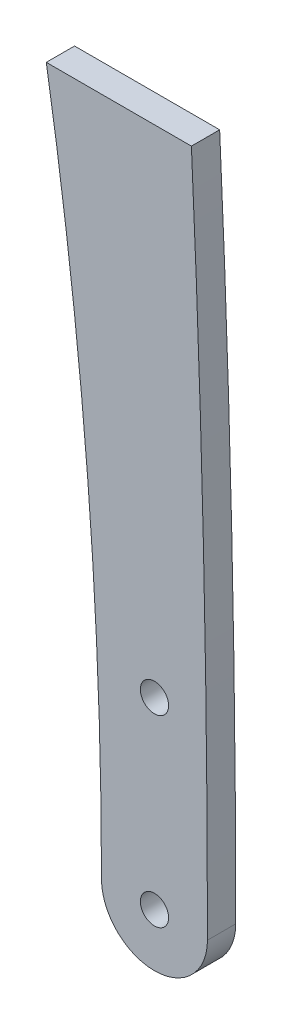
ISO-10303-21;
HEADER;
FILE_DESCRIPTION(('STEP AP214'),'2;1');
FILE_NAME('part.step','',(''),(''),'','','');
FILE_SCHEMA(('AUTOMOTIVE_DESIGN { 1 0 10303 214 1 1 1 1 }'));
ENDSEC;
DATA;
#1=APPLICATION_CONTEXT('core data for automotive mechanical design processes');
#2=APPLICATION_PROTOCOL_DEFINITION('international standard','automotive_design',2000,#1);
#3=PRODUCT_CONTEXT('',#1,'mechanical');
#4=PRODUCT('Part','Part','',(#3));
#5=PRODUCT_RELATED_PRODUCT_CATEGORY('part','',(#4));
#6=PRODUCT_DEFINITION_FORMATION('','',#4);
#7=PRODUCT_DEFINITION_CONTEXT('part definition',#1,'design');
#8=PRODUCT_DEFINITION('design','',#6,#7);
#9=PRODUCT_DEFINITION_SHAPE('','',#8);
#10=(LENGTH_UNIT() NAMED_UNIT(*) SI_UNIT(.MILLI.,.METRE.));
#11=(NAMED_UNIT(*) PLANE_ANGLE_UNIT() SI_UNIT($,.RADIAN.));
#12=(NAMED_UNIT(*) SI_UNIT($,.STERADIAN.) SOLID_ANGLE_UNIT());
#13=UNCERTAINTY_MEASURE_WITH_UNIT(LENGTH_MEASURE(1.E-05),#10,'distance_accuracy_value','');
#14=(GEOMETRIC_REPRESENTATION_CONTEXT(3) GLOBAL_UNCERTAINTY_ASSIGNED_CONTEXT((#13)) GLOBAL_UNIT_ASSIGNED_CONTEXT((#10,
#11,#12)) REPRESENTATION_CONTEXT('',''));
#15=CARTESIAN_POINT('',(0.,0.,0.));
#16=DIRECTION('',(0.,0.,1.));
#17=DIRECTION('',(1.,0.,0.));
#18=AXIS2_PLACEMENT_3D('',#15,#16,#17);
#19=CARTESIAN_POINT('',(-460.137084466851,0.,3.048));
#20=DIRECTION('',(0.,0.,-1.));
#21=DIRECTION('',(-1.,0.,0.));
#22=AXIS2_PLACEMENT_3D('',#19,#20,#21);
#23=CYLINDRICAL_SURFACE('',#22,454.422084466851);
#24=CARTESIAN_POINT('',(-460.137084466851,0.,0.));
#25=DIRECTION('',(0.,0.,-1.));
#26=DIRECTION('',(1.,0.,0.));
#27=AXIS2_PLACEMENT_3D('',#24,#25,#26);
#28=CIRCLE('',#27,454.422084466851);
#29=CARTESIAN_POINT('',(-11.667509286382,73.3107835768198,0.));
#30=VERTEX_POINT('',#29);
#31=CARTESIAN_POINT('',(-5.715,0.,0.));
#32=VERTEX_POINT('',#31);
#33=EDGE_CURVE('E112',#30,#32,#28,.T.);
#34=ORIENTED_EDGE('',*,*,#33,.T.);
#35=DIRECTION('',(0.,0.,-1.));
#36=VECTOR('',#35,1.);
#37=CARTESIAN_POINT('',(-5.715,0.,3.048));
#38=LINE('',#37,#36);
#39=CARTESIAN_POINT('',(-5.715,0.,3.048));
#40=VERTEX_POINT('',#39);
#41=EDGE_CURVE('E11',#40,#32,#38,.T.);
#42=ORIENTED_EDGE('',*,*,#41,.F.);
#43=CARTESIAN_POINT('',(-460.137084466851,0.,3.048));
#44=DIRECTION('',(0.,0.,-1.));
#45=DIRECTION('',(1.,0.,0.));
#46=AXIS2_PLACEMENT_3D('',#43,#44,#45);
#47=CIRCLE('',#46,454.422084466851);
#48=CARTESIAN_POINT('',(-11.667509286382,73.3107835768198,3.048));
#49=VERTEX_POINT('',#48);
#50=EDGE_CURVE('E96',#49,#40,#47,.T.);
#51=ORIENTED_EDGE('',*,*,#50,.F.);
#52=DIRECTION('',(0.,0.,-1.));
#53=VECTOR('',#52,1.);
#54=CARTESIAN_POINT('',(-11.667509286382,73.3107835768198,3.048));
#55=LINE('',#54,#53);
#56=EDGE_CURVE('E108',#49,#30,#55,.T.);
#57=ORIENTED_EDGE('',*,*,#56,.T.);
#58=EDGE_LOOP('',(#34,#42,#51,#57));
#59=FACE_BOUND('',#58,.T.);
#60=ADVANCED_FACE('F44',(#59),#23,.F.);
#61=CARTESIAN_POINT('',(0.,0.,3.048));
#62=DIRECTION('',(0.,0.,-1.));
#63=DIRECTION('',(-1.,0.,0.));
#64=AXIS2_PLACEMENT_3D('',#61,#62,#63);
#65=CYLINDRICAL_SURFACE('',#64,5.715);
#66=CARTESIAN_POINT('',(0.,0.,0.));
#67=DIRECTION('',(0.,0.,1.));
#68=DIRECTION('',(1.,0.,0.));
#69=AXIS2_PLACEMENT_3D('',#66,#67,#68);
#70=CIRCLE('',#69,5.715);
#71=CARTESIAN_POINT('',(5.715,0.,0.));
#72=VERTEX_POINT('',#71);
#73=EDGE_CURVE('E101',#32,#72,#70,.T.);
#74=ORIENTED_EDGE('',*,*,#73,.T.);
#75=DIRECTION('',(0.,0.,-1.));
#76=VECTOR('',#75,1.);
#77=CARTESIAN_POINT('',(5.715,0.,3.048));
#78=LINE('',#77,#76);
#79=CARTESIAN_POINT('',(5.715,0.,3.048));
#80=VERTEX_POINT('',#79);
#81=EDGE_CURVE('E53',#80,#72,#78,.T.);
#82=ORIENTED_EDGE('',*,*,#81,.F.);
#83=CARTESIAN_POINT('',(0.,0.,3.048));
#84=DIRECTION('',(0.,0.,1.));
#85=DIRECTION('',(1.,0.,0.));
#86=AXIS2_PLACEMENT_3D('',#83,#84,#85);
#87=CIRCLE('',#86,5.715);
#88=EDGE_CURVE('E91',#40,#80,#87,.T.);
#89=ORIENTED_EDGE('',*,*,#88,.F.);
#90=ORIENTED_EDGE('',*,*,#41,.T.);
#91=EDGE_LOOP('',(#74,#82,#89,#90));
#92=FACE_BOUND('',#91,.T.);
#93=ADVANCED_FACE('F100',(#92),#65,.T.);
#94=CARTESIAN_POINT('',(-1547.37777404695,-9.33281230075522E-13,3.048));
#95=DIRECTION('',(0.,0.,-1.));
#96=DIRECTION('',(-1.,0.,0.));
#97=AXIS2_PLACEMENT_3D('',#94,#95,#96);
#98=CYLINDRICAL_SURFACE('',#97,1553.09277404695);
#99=CARTESIAN_POINT('',(-1547.37777404695,-9.33281230075522E-13,0.));
#100=DIRECTION('',(0.,0.,1.));
#101=DIRECTION('',(1.,0.,0.));
#102=AXIS2_PLACEMENT_3D('',#99,#100,#101);
#103=CIRCLE('',#102,1553.09277404695);
#104=CARTESIAN_POINT('',(3.98378723017623,73.3107835768198,0.));
#105=VERTEX_POINT('',#104);
#106=EDGE_CURVE('E78',#72,#105,#103,.T.);
#107=ORIENTED_EDGE('',*,*,#106,.T.);
#108=DIRECTION('',(0.,0.,-1.));
#109=VECTOR('',#108,1.);
#110=CARTESIAN_POINT('',(3.98378723017623,73.3107835768198,3.048));
#111=LINE('',#110,#109);
#112=CARTESIAN_POINT('',(3.98378723017623,73.3107835768198,3.048));
#113=VERTEX_POINT('',#112);
#114=EDGE_CURVE('E103',#113,#105,#111,.T.);
#115=ORIENTED_EDGE('',*,*,#114,.F.);
#116=CARTESIAN_POINT('',(-1547.37777404695,-9.33281230075522E-13,3.048));
#117=DIRECTION('',(0.,0.,1.));
#118=DIRECTION('',(1.,0.,0.));
#119=AXIS2_PLACEMENT_3D('',#116,#117,#118);
#120=CIRCLE('',#119,1553.09277404695);
#121=EDGE_CURVE('E94',#80,#113,#120,.T.);
#122=ORIENTED_EDGE('',*,*,#121,.F.);
#123=ORIENTED_EDGE('',*,*,#81,.T.);
#124=EDGE_LOOP('',(#107,#115,#122,#123));
#125=FACE_BOUND('',#124,.T.);
#126=ADVANCED_FACE('F104',(#125),#98,.T.);
#127=CARTESIAN_POINT('',(-11.667509286382,73.3107835768198,3.048));
#128=DIRECTION('',(0.,-1.,0.));
#129=DIRECTION('',(1.,0.,0.));
#130=AXIS2_PLACEMENT_3D('',#127,#128,#129);
#131=PLANE('',#130);
#132=DIRECTION('',(-1.,0.,0.));
#133=VECTOR('',#132,1.);
#134=CARTESIAN_POINT('',(-11.667509286382,73.3107835768198,0.));
#135=LINE('',#134,#133);
#136=EDGE_CURVE('E84',#105,#30,#135,.T.);
#137=ORIENTED_EDGE('',*,*,#136,.T.);
#138=ORIENTED_EDGE('',*,*,#56,.F.);
#139=DIRECTION('',(-1.,0.,0.));
#140=VECTOR('',#139,1.);
#141=CARTESIAN_POINT('',(-11.667509286382,73.3107835768198,3.048));
#142=LINE('',#141,#140);
#143=EDGE_CURVE('E61',#113,#49,#142,.T.);
#144=ORIENTED_EDGE('',*,*,#143,.F.);
#145=ORIENTED_EDGE('',*,*,#114,.T.);
#146=EDGE_LOOP('',(#137,#138,#144,#145));
#147=FACE_BOUND('',#146,.T.);
#148=ADVANCED_FACE('F126',(#147),#131,.F.);
#149=CARTESIAN_POINT('',(-460.137084466851,0.,3.048));
#150=DIRECTION('',(0.,0.,1.));
#151=DIRECTION('',(1.,0.,0.));
#152=AXIS2_PLACEMENT_3D('',#149,#150,#151);
#153=PLANE('',#152);
#154=CARTESIAN_POINT('',(0.,0.,3.048));
#155=DIRECTION('',(0.,0.,1.));
#156=DIRECTION('',(1.,0.,0.));
#157=AXIS2_PLACEMENT_3D('',#154,#155,#156);
#158=CIRCLE('',#157,1.524);
#159=CARTESIAN_POINT('',(1.524,0.,3.048));
#160=VERTEX_POINT('',#159);
#161=EDGE_CURVE('E141',#160,#160,#158,.T.);
#162=ORIENTED_EDGE('',*,*,#161,.F.);
#163=EDGE_LOOP('',(#162));
#164=FACE_BOUND('',#163,.T.);
#165=CARTESIAN_POINT('',(0.,19.812,3.048));
#166=DIRECTION('',(0.,0.,1.));
#167=DIRECTION('',(1.,0.,0.));
#168=AXIS2_PLACEMENT_3D('',#165,#166,#167);
#169=CIRCLE('',#168,1.524);
#170=CARTESIAN_POINT('',(1.524,19.812,3.048));
#171=VERTEX_POINT('',#170);
#172=EDGE_CURVE('E137',#171,#171,#169,.T.);
#173=ORIENTED_EDGE('',*,*,#172,.F.);
#174=EDGE_LOOP('',(#173));
#175=FACE_BOUND('',#174,.T.);
#176=ORIENTED_EDGE('',*,*,#50,.T.);
#177=ORIENTED_EDGE('',*,*,#88,.T.);
#178=ORIENTED_EDGE('',*,*,#121,.T.);
#179=ORIENTED_EDGE('',*,*,#143,.T.);
#180=EDGE_LOOP('',(#176,#177,#178,#179));
#181=FACE_BOUND('',#180,.T.);
#182=ADVANCED_FACE('F92',(#164,#175,#181),#153,.T.);
#183=CARTESIAN_POINT('',(-460.137084466851,0.,0.));
#184=DIRECTION('',(0.,0.,1.));
#185=DIRECTION('',(1.,0.,0.));
#186=AXIS2_PLACEMENT_3D('',#183,#184,#185);
#187=PLANE('',#186);
#188=CARTESIAN_POINT('',(0.,0.,0.));
#189=DIRECTION('',(0.,0.,1.));
#190=DIRECTION('',(1.,0.,0.));
#191=AXIS2_PLACEMENT_3D('',#188,#189,#190);
#192=CIRCLE('',#191,1.524);
#193=CARTESIAN_POINT('',(1.524,0.,0.));
#194=VERTEX_POINT('',#193);
#195=EDGE_CURVE('E116',#194,#194,#192,.T.);
#196=ORIENTED_EDGE('',*,*,#195,.T.);
#197=EDGE_LOOP('',(#196));
#198=FACE_BOUND('',#197,.T.);
#199=CARTESIAN_POINT('',(0.,19.812,0.));
#200=DIRECTION('',(0.,0.,1.));
#201=DIRECTION('',(1.,0.,0.));
#202=AXIS2_PLACEMENT_3D('',#199,#200,#201);
#203=CIRCLE('',#202,1.524);
#204=CARTESIAN_POINT('',(1.524,19.812,0.));
#205=VERTEX_POINT('',#204);
#206=EDGE_CURVE('E133',#205,#205,#203,.T.);
#207=ORIENTED_EDGE('',*,*,#206,.T.);
#208=EDGE_LOOP('',(#207));
#209=FACE_BOUND('',#208,.T.);
#210=ORIENTED_EDGE('',*,*,#33,.F.);
#211=ORIENTED_EDGE('',*,*,#136,.F.);
#212=ORIENTED_EDGE('',*,*,#106,.F.);
#213=ORIENTED_EDGE('',*,*,#73,.F.);
#214=EDGE_LOOP('',(#210,#211,#212,#213));
#215=FACE_BOUND('',#214,.T.);
#216=ADVANCED_FACE('F129',(#198,#209,#215),#187,.F.);
#217=CARTESIAN_POINT('',(0.,19.812,0.));
#218=DIRECTION('',(0.,0.,1.));
#219=DIRECTION('',(1.,0.,0.));
#220=AXIS2_PLACEMENT_3D('',#217,#218,#219);
#221=CYLINDRICAL_SURFACE('',#220,1.524);
#222=CARTESIAN_POINT('',(1.524,19.812,0.));
#223=CARTESIAN_POINT('',(1.524,19.812,0.03175));
#224=CARTESIAN_POINT('',(1.524,19.812,0.0635));
#225=CARTESIAN_POINT('',(1.524,19.812,0.127));
#226=CARTESIAN_POINT('',(1.524,19.812,0.15875));
#227=CARTESIAN_POINT('',(1.524,19.812,0.22225));
#228=CARTESIAN_POINT('',(1.524,19.812,0.254));
#229=CARTESIAN_POINT('',(1.524,19.812,0.3175));
#230=CARTESIAN_POINT('',(1.524,19.812,0.34925));
#231=CARTESIAN_POINT('',(1.524,19.812,0.41275));
#232=CARTESIAN_POINT('',(1.524,19.812,0.4445));
#233=CARTESIAN_POINT('',(1.524,19.812,0.508));
#234=CARTESIAN_POINT('',(1.524,19.812,0.53975));
#235=CARTESIAN_POINT('',(1.524,19.812,0.60325));
#236=CARTESIAN_POINT('',(1.524,19.812,0.635));
#237=CARTESIAN_POINT('',(1.524,19.812,0.6985));
#238=CARTESIAN_POINT('',(1.524,19.812,0.73025));
#239=CARTESIAN_POINT('',(1.524,19.812,0.79375));
#240=CARTESIAN_POINT('',(1.524,19.812,0.8255));
#241=CARTESIAN_POINT('',(1.524,19.812,0.889));
#242=CARTESIAN_POINT('',(1.524,19.812,0.92075));
#243=CARTESIAN_POINT('',(1.524,19.812,0.98425));
#244=CARTESIAN_POINT('',(1.524,19.812,1.016));
#245=CARTESIAN_POINT('',(1.524,19.812,1.0795));
#246=CARTESIAN_POINT('',(1.524,19.812,1.11125));
#247=CARTESIAN_POINT('',(1.524,19.812,1.17475));
#248=CARTESIAN_POINT('',(1.524,19.812,1.2065));
#249=CARTESIAN_POINT('',(1.524,19.812,1.27));
#250=CARTESIAN_POINT('',(1.524,19.812,1.30175));
#251=CARTESIAN_POINT('',(1.524,19.812,1.36525));
#252=CARTESIAN_POINT('',(1.524,19.812,1.397));
#253=CARTESIAN_POINT('',(1.524,19.812,1.4605));
#254=CARTESIAN_POINT('',(1.524,19.812,1.49225));
#255=CARTESIAN_POINT('',(1.524,19.812,1.55575));
#256=CARTESIAN_POINT('',(1.524,19.812,1.5875));
#257=CARTESIAN_POINT('',(1.524,19.812,1.651));
#258=CARTESIAN_POINT('',(1.524,19.812,1.68275));
#259=CARTESIAN_POINT('',(1.524,19.812,1.74625));
#260=CARTESIAN_POINT('',(1.524,19.812,1.778));
#261=CARTESIAN_POINT('',(1.524,19.812,1.8415));
#262=CARTESIAN_POINT('',(1.524,19.812,1.87325));
#263=CARTESIAN_POINT('',(1.524,19.812,1.93675));
#264=CARTESIAN_POINT('',(1.524,19.812,1.9685));
#265=CARTESIAN_POINT('',(1.524,19.812,2.032));
#266=CARTESIAN_POINT('',(1.524,19.812,2.06375));
#267=CARTESIAN_POINT('',(1.524,19.812,2.12725));
#268=CARTESIAN_POINT('',(1.524,19.812,2.159));
#269=CARTESIAN_POINT('',(1.524,19.812,2.2225));
#270=CARTESIAN_POINT('',(1.524,19.812,2.25425));
#271=CARTESIAN_POINT('',(1.524,19.812,2.31775));
#272=CARTESIAN_POINT('',(1.524,19.812,2.3495));
#273=CARTESIAN_POINT('',(1.524,19.812,2.413));
#274=CARTESIAN_POINT('',(1.524,19.812,2.44475));
#275=CARTESIAN_POINT('',(1.524,19.812,2.50825));
#276=CARTESIAN_POINT('',(1.524,19.812,2.54));
#277=CARTESIAN_POINT('',(1.524,19.812,2.6035));
#278=CARTESIAN_POINT('',(1.524,19.812,2.63525));
#279=CARTESIAN_POINT('',(1.524,19.812,2.69875));
#280=CARTESIAN_POINT('',(1.524,19.812,2.7305));
#281=CARTESIAN_POINT('',(1.524,19.812,2.794));
#282=CARTESIAN_POINT('',(1.524,19.812,2.82575));
#283=CARTESIAN_POINT('',(1.524,19.812,2.88925));
#284=CARTESIAN_POINT('',(1.524,19.812,2.921));
#285=CARTESIAN_POINT('',(1.524,19.812,2.9845));
#286=CARTESIAN_POINT('',(1.524,19.812,3.01625));
#287=CARTESIAN_POINT('',(1.524,19.812,3.048));
#288=B_SPLINE_CURVE_WITH_KNOTS('',3,(#222,#223,#224,#225,#226,#227,#228,#229,#230,#231,#232,
#233,#234,#235,#236,#237,#238,#239,#240,#241,#242,#243,#244,#245,#246,#247,#248,#249,#250,#251,
#252,#253,#254,#255,#256,#257,#258,#259,#260,#261,#262,#263,#264,#265,#266,#267,#268,#269,#270,
#271,#272,#273,#274,#275,#276,#277,#278,#279,#280,#281,#282,#283,#284,#285,#286,#287),
.UNSPECIFIED.,.F.,.F.,(4,2,2,2,2,2,2,2,2,2,2,2,2,2,2,2,2,2,2,2,2,2,2,2,2,2,2,2,2,2,2,2,4),(0.,
0.09525,0.1905,0.28575,0.381,0.47625,0.5715,0.66675,0.762,0.85725,0.9525,1.04775,1.143,1.23825,
1.3335,1.42875,1.524,1.61925,1.7145,1.80975,1.905,2.00025,2.0955,2.19075,2.286,2.38125,2.4765,
2.57175,2.667,2.76225,2.8575,2.95275,3.048),.UNSPECIFIED.);
#289=EDGE_CURVE('BSEAM154',#205,#171,#288,.T.);
#290=ORIENTED_EDGE('',*,*,#206,.F.);
#291=ORIENTED_EDGE('',*,*,#172,.T.);
#292=ORIENTED_EDGE('',*,*,#289,.T.);
#293=ORIENTED_EDGE('',*,*,#289,.F.);
#294=EDGE_LOOP('',(#290,#292,#291,#293));
#295=FACE_BOUND('',#294,.T.);
#296=ADVANCED_FACE('F154',(#295),#221,.F.);
#297=CARTESIAN_POINT('',(0.,0.,0.));
#298=DIRECTION('',(0.,0.,1.));
#299=DIRECTION('',(1.,0.,0.));
#300=AXIS2_PLACEMENT_3D('',#297,#298,#299);
#301=CYLINDRICAL_SURFACE('',#300,1.524);
#302=CARTESIAN_POINT('',(1.524,0.,0.));
#303=CARTESIAN_POINT('',(1.524,0.,0.03175));
#304=CARTESIAN_POINT('',(1.524,0.,0.0635));
#305=CARTESIAN_POINT('',(1.524,0.,0.127));
#306=CARTESIAN_POINT('',(1.524,0.,0.15875));
#307=CARTESIAN_POINT('',(1.524,0.,0.22225));
#308=CARTESIAN_POINT('',(1.524,0.,0.254));
#309=CARTESIAN_POINT('',(1.524,0.,0.3175));
#310=CARTESIAN_POINT('',(1.524,0.,0.34925));
#311=CARTESIAN_POINT('',(1.524,0.,0.41275));
#312=CARTESIAN_POINT('',(1.524,0.,0.4445));
#313=CARTESIAN_POINT('',(1.524,0.,0.508));
#314=CARTESIAN_POINT('',(1.524,0.,0.53975));
#315=CARTESIAN_POINT('',(1.524,0.,0.60325));
#316=CARTESIAN_POINT('',(1.524,0.,0.635));
#317=CARTESIAN_POINT('',(1.524,0.,0.6985));
#318=CARTESIAN_POINT('',(1.524,0.,0.73025));
#319=CARTESIAN_POINT('',(1.524,0.,0.79375));
#320=CARTESIAN_POINT('',(1.524,0.,0.8255));
#321=CARTESIAN_POINT('',(1.524,0.,0.889));
#322=CARTESIAN_POINT('',(1.524,0.,0.92075));
#323=CARTESIAN_POINT('',(1.524,0.,0.98425));
#324=CARTESIAN_POINT('',(1.524,0.,1.016));
#325=CARTESIAN_POINT('',(1.524,0.,1.0795));
#326=CARTESIAN_POINT('',(1.524,0.,1.11125));
#327=CARTESIAN_POINT('',(1.524,0.,1.17475));
#328=CARTESIAN_POINT('',(1.524,0.,1.2065));
#329=CARTESIAN_POINT('',(1.524,0.,1.27));
#330=CARTESIAN_POINT('',(1.524,0.,1.30175));
#331=CARTESIAN_POINT('',(1.524,0.,1.36525));
#332=CARTESIAN_POINT('',(1.524,0.,1.397));
#333=CARTESIAN_POINT('',(1.524,0.,1.4605));
#334=CARTESIAN_POINT('',(1.524,0.,1.49225));
#335=CARTESIAN_POINT('',(1.524,0.,1.55575));
#336=CARTESIAN_POINT('',(1.524,0.,1.5875));
#337=CARTESIAN_POINT('',(1.524,0.,1.651));
#338=CARTESIAN_POINT('',(1.524,0.,1.68275));
#339=CARTESIAN_POINT('',(1.524,0.,1.74625));
#340=CARTESIAN_POINT('',(1.524,0.,1.778));
#341=CARTESIAN_POINT('',(1.524,0.,1.8415));
#342=CARTESIAN_POINT('',(1.524,0.,1.87325));
#343=CARTESIAN_POINT('',(1.524,0.,1.93675));
#344=CARTESIAN_POINT('',(1.524,0.,1.9685));
#345=CARTESIAN_POINT('',(1.524,0.,2.032));
#346=CARTESIAN_POINT('',(1.524,0.,2.06375));
#347=CARTESIAN_POINT('',(1.524,0.,2.12725));
#348=CARTESIAN_POINT('',(1.524,0.,2.159));
#349=CARTESIAN_POINT('',(1.524,0.,2.2225));
#350=CARTESIAN_POINT('',(1.524,0.,2.25425));
#351=CARTESIAN_POINT('',(1.524,0.,2.31775));
#352=CARTESIAN_POINT('',(1.524,0.,2.3495));
#353=CARTESIAN_POINT('',(1.524,0.,2.413));
#354=CARTESIAN_POINT('',(1.524,0.,2.44475));
#355=CARTESIAN_POINT('',(1.524,0.,2.50825));
#356=CARTESIAN_POINT('',(1.524,0.,2.54));
#357=CARTESIAN_POINT('',(1.524,0.,2.6035));
#358=CARTESIAN_POINT('',(1.524,0.,2.63525));
#359=CARTESIAN_POINT('',(1.524,0.,2.69875));
#360=CARTESIAN_POINT('',(1.524,0.,2.7305));
#361=CARTESIAN_POINT('',(1.524,0.,2.794));
#362=CARTESIAN_POINT('',(1.524,0.,2.82575));
#363=CARTESIAN_POINT('',(1.524,0.,2.88925));
#364=CARTESIAN_POINT('',(1.524,0.,2.921));
#365=CARTESIAN_POINT('',(1.524,0.,2.9845));
#366=CARTESIAN_POINT('',(1.524,0.,3.01625));
#367=CARTESIAN_POINT('',(1.524,0.,3.048));
#368=B_SPLINE_CURVE_WITH_KNOTS('',3,(#302,#303,#304,#305,#306,#307,#308,#309,#310,#311,#312,
#313,#314,#315,#316,#317,#318,#319,#320,#321,#322,#323,#324,#325,#326,#327,#328,#329,#330,#331,
#332,#333,#334,#335,#336,#337,#338,#339,#340,#341,#342,#343,#344,#345,#346,#347,#348,#349,#350,
#351,#352,#353,#354,#355,#356,#357,#358,#359,#360,#361,#362,#363,#364,#365,#366,#367),
.UNSPECIFIED.,.F.,.F.,(4,2,2,2,2,2,2,2,2,2,2,2,2,2,2,2,2,2,2,2,2,2,2,2,2,2,2,2,2,2,2,2,4),(0.,
0.09525,0.1905,0.28575,0.381,0.47625,0.5715,0.66675,0.762,0.85725,0.9525,1.04775,1.143,1.23825,
1.3335,1.42875,1.524,1.61925,1.7145,1.80975,1.905,2.00025,2.0955,2.19075,2.286,2.38125,2.4765,
2.57175,2.667,2.76225,2.8575,2.95275,3.048),.UNSPECIFIED.);
#369=EDGE_CURVE('BSEAM151',#194,#160,#368,.T.);
#370=ORIENTED_EDGE('',*,*,#195,.F.);
#371=ORIENTED_EDGE('',*,*,#161,.T.);
#372=ORIENTED_EDGE('',*,*,#369,.T.);
#373=ORIENTED_EDGE('',*,*,#369,.F.);
#374=EDGE_LOOP('',(#370,#372,#371,#373));
#375=FACE_BOUND('',#374,.T.);
#376=ADVANCED_FACE('F151',(#375),#301,.F.);
#377=CLOSED_SHELL('',(#60,#93,#126,#148,#182,#216,#296,#376));
#378=MANIFOLD_SOLID_BREP('B2',#377);
#379=ADVANCED_BREP_SHAPE_REPRESENTATION('',(#18,#378),#14);
#380=SHAPE_DEFINITION_REPRESENTATION(#9,#379);
ENDSEC;
END-ISO-10303-21;
